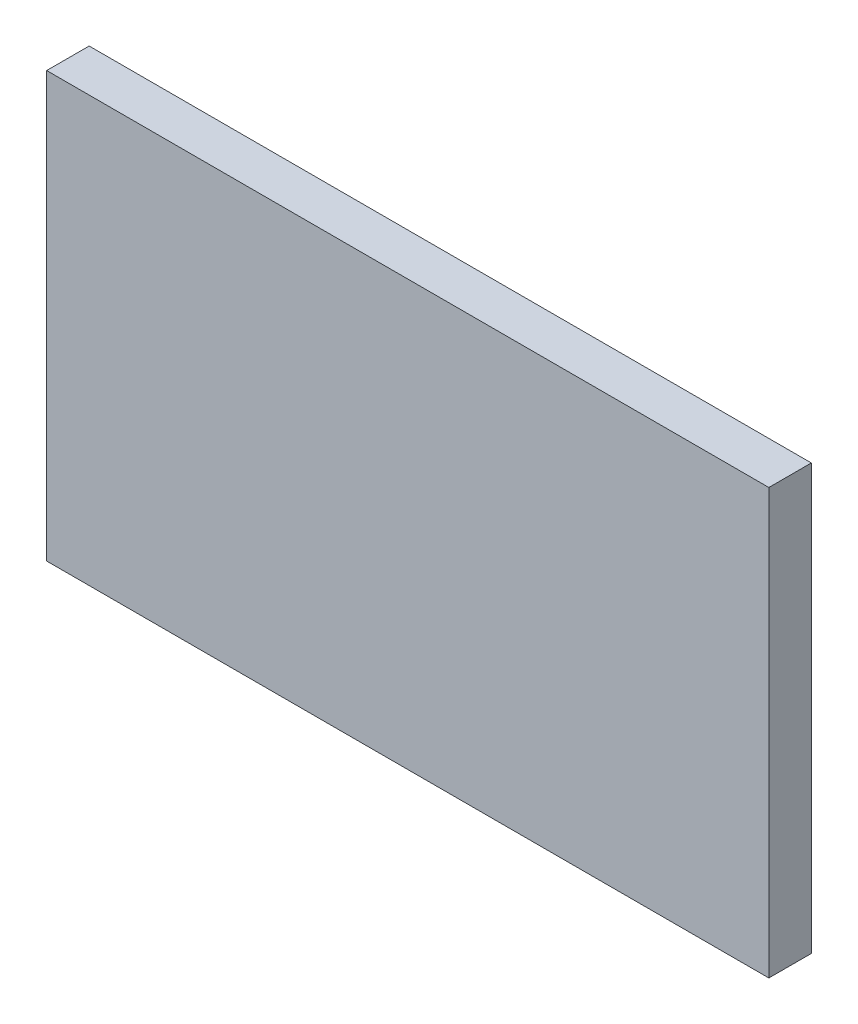
ISO-10303-21;
HEADER;
FILE_DESCRIPTION(('STEP AP214'),'2;1');
FILE_NAME('part.step','',(''),(''),'','','');
FILE_SCHEMA(('AUTOMOTIVE_DESIGN { 1 0 10303 214 1 1 1 1 }'));
ENDSEC;
DATA;
#1=APPLICATION_CONTEXT('core data for automotive mechanical design processes');
#2=APPLICATION_PROTOCOL_DEFINITION('international standard','automotive_design',2000,#1);
#3=PRODUCT_CONTEXT('',#1,'mechanical');
#4=PRODUCT('Part','Part','',(#3));
#5=PRODUCT_RELATED_PRODUCT_CATEGORY('part','',(#4));
#6=PRODUCT_DEFINITION_FORMATION('','',#4);
#7=PRODUCT_DEFINITION_CONTEXT('part definition',#1,'design');
#8=PRODUCT_DEFINITION('design','',#6,#7);
#9=PRODUCT_DEFINITION_SHAPE('','',#8);
#10=(LENGTH_UNIT() NAMED_UNIT(*) SI_UNIT(.MILLI.,.METRE.));
#11=(NAMED_UNIT(*) PLANE_ANGLE_UNIT() SI_UNIT($,.RADIAN.));
#12=(NAMED_UNIT(*) SI_UNIT($,.STERADIAN.) SOLID_ANGLE_UNIT());
#13=UNCERTAINTY_MEASURE_WITH_UNIT(LENGTH_MEASURE(1.E-05),#10,'distance_accuracy_value','');
#14=(GEOMETRIC_REPRESENTATION_CONTEXT(3) GLOBAL_UNCERTAINTY_ASSIGNED_CONTEXT((#13)) GLOBAL_UNIT_ASSIGNED_CONTEXT((#10,
#11,#12)) REPRESENTATION_CONTEXT('',''));
#15=CARTESIAN_POINT('',(0.,0.,0.));
#16=DIRECTION('',(0.,0.,1.));
#17=DIRECTION('',(1.,0.,0.));
#18=AXIS2_PLACEMENT_3D('',#15,#16,#17);
#19=CARTESIAN_POINT('',(53.975,31.75,6.35));
#20=DIRECTION('',(-1.,0.,0.));
#21=DIRECTION('',(0.,-1.,0.));
#22=AXIS2_PLACEMENT_3D('',#19,#20,#21);
#23=PLANE('',#22);
#24=DIRECTION('',(0.,1.,0.));
#25=VECTOR('',#24,1.);
#26=CARTESIAN_POINT('',(53.975,31.75,0.));
#27=LINE('',#26,#25);
#28=CARTESIAN_POINT('',(53.975,-31.75,0.));
#29=VERTEX_POINT('',#28);
#30=CARTESIAN_POINT('',(53.975,31.75,0.));
#31=VERTEX_POINT('',#30);
#32=EDGE_CURVE('E96',#29,#31,#27,.T.);
#33=ORIENTED_EDGE('',*,*,#32,.T.);
#34=DIRECTION('',(0.,0.,-1.));
#35=VECTOR('',#34,1.);
#36=CARTESIAN_POINT('',(53.975,31.75,6.35));
#37=LINE('',#36,#35);
#38=CARTESIAN_POINT('',(53.975,31.75,6.35));
#39=VERTEX_POINT('',#38);
#40=EDGE_CURVE('E11',#39,#31,#37,.T.);
#41=ORIENTED_EDGE('',*,*,#40,.F.);
#42=DIRECTION('',(0.,1.,0.));
#43=VECTOR('',#42,1.);
#44=CARTESIAN_POINT('',(53.975,31.75,6.35));
#45=LINE('',#44,#43);
#46=CARTESIAN_POINT('',(53.975,-31.75,6.35));
#47=VERTEX_POINT('',#46);
#48=EDGE_CURVE('E84',#47,#39,#45,.T.);
#49=ORIENTED_EDGE('',*,*,#48,.F.);
#50=DIRECTION('',(0.,0.,-1.));
#51=VECTOR('',#50,1.);
#52=CARTESIAN_POINT('',(53.975,-31.75,6.35));
#53=LINE('',#52,#51);
#54=EDGE_CURVE('E92',#47,#29,#53,.T.);
#55=ORIENTED_EDGE('',*,*,#54,.T.);
#56=EDGE_LOOP('',(#33,#41,#49,#55));
#57=FACE_BOUND('',#56,.T.);
#58=ADVANCED_FACE('F33',(#57),#23,.F.);
#59=CARTESIAN_POINT('',(-53.975,31.75,6.35));
#60=DIRECTION('',(0.,-1.,0.));
#61=DIRECTION('',(0.,0.,-1.));
#62=AXIS2_PLACEMENT_3D('',#59,#60,#61);
#63=PLANE('',#62);
#64=DIRECTION('',(-1.,0.,0.));
#65=VECTOR('',#64,1.);
#66=CARTESIAN_POINT('',(-53.975,31.75,0.));
#67=LINE('',#66,#65);
#68=CARTESIAN_POINT('',(-53.975,31.75,0.));
#69=VERTEX_POINT('',#68);
#70=EDGE_CURVE('E88',#31,#69,#67,.T.);
#71=ORIENTED_EDGE('',*,*,#70,.T.);
#72=DIRECTION('',(0.,0.,-1.));
#73=VECTOR('',#72,1.);
#74=CARTESIAN_POINT('',(-53.975,31.75,6.35));
#75=LINE('',#74,#73);
#76=CARTESIAN_POINT('',(-53.975,31.75,6.35));
#77=VERTEX_POINT('',#76);
#78=EDGE_CURVE('E41',#77,#69,#75,.T.);
#79=ORIENTED_EDGE('',*,*,#78,.F.);
#80=DIRECTION('',(-1.,0.,0.));
#81=VECTOR('',#80,1.);
#82=CARTESIAN_POINT('',(-53.975,31.75,6.35));
#83=LINE('',#82,#81);
#84=EDGE_CURVE('E79',#39,#77,#83,.T.);
#85=ORIENTED_EDGE('',*,*,#84,.F.);
#86=ORIENTED_EDGE('',*,*,#40,.T.);
#87=EDGE_LOOP('',(#71,#79,#85,#86));
#88=FACE_BOUND('',#87,.T.);
#89=ADVANCED_FACE('F87',(#88),#63,.F.);
#90=CARTESIAN_POINT('',(-53.975,31.75,6.35));
#91=DIRECTION('',(1.,0.,0.));
#92=DIRECTION('',(0.,1.,0.));
#93=AXIS2_PLACEMENT_3D('',#90,#91,#92);
#94=PLANE('',#93);
#95=DIRECTION('',(0.,-1.,0.));
#96=VECTOR('',#95,1.);
#97=CARTESIAN_POINT('',(-53.975,31.75,0.));
#98=LINE('',#97,#96);
#99=CARTESIAN_POINT('',(-53.975,-31.75,0.));
#100=VERTEX_POINT('',#99);
#101=EDGE_CURVE('E66',#69,#100,#98,.T.);
#102=ORIENTED_EDGE('',*,*,#101,.T.);
#103=DIRECTION('',(0.,0.,-1.));
#104=VECTOR('',#103,1.);
#105=CARTESIAN_POINT('',(-53.975,-31.75,6.35));
#106=LINE('',#105,#104);
#107=CARTESIAN_POINT('',(-53.975,-31.75,6.35));
#108=VERTEX_POINT('',#107);
#109=EDGE_CURVE('E89',#108,#100,#106,.T.);
#110=ORIENTED_EDGE('',*,*,#109,.F.);
#111=DIRECTION('',(0.,-1.,0.));
#112=VECTOR('',#111,1.);
#113=CARTESIAN_POINT('',(-53.975,31.75,6.35));
#114=LINE('',#113,#112);
#115=EDGE_CURVE('E82',#77,#108,#114,.T.);
#116=ORIENTED_EDGE('',*,*,#115,.F.);
#117=ORIENTED_EDGE('',*,*,#78,.T.);
#118=EDGE_LOOP('',(#102,#110,#116,#117));
#119=FACE_BOUND('',#118,.T.);
#120=ADVANCED_FACE('F90',(#119),#94,.F.);
#121=CARTESIAN_POINT('',(-53.975,-31.75,6.35));
#122=DIRECTION('',(0.,1.,0.));
#123=DIRECTION('',(0.,0.,1.));
#124=AXIS2_PLACEMENT_3D('',#121,#122,#123);
#125=PLANE('',#124);
#126=DIRECTION('',(1.,0.,0.));
#127=VECTOR('',#126,1.);
#128=CARTESIAN_POINT('',(-53.975,-31.75,0.));
#129=LINE('',#128,#127);
#130=EDGE_CURVE('E72',#100,#29,#129,.T.);
#131=ORIENTED_EDGE('',*,*,#130,.T.);
#132=ORIENTED_EDGE('',*,*,#54,.F.);
#133=DIRECTION('',(1.,0.,0.));
#134=VECTOR('',#133,1.);
#135=CARTESIAN_POINT('',(-53.975,-31.75,6.35));
#136=LINE('',#135,#134);
#137=EDGE_CURVE('E49',#108,#47,#136,.T.);
#138=ORIENTED_EDGE('',*,*,#137,.F.);
#139=ORIENTED_EDGE('',*,*,#109,.T.);
#140=EDGE_LOOP('',(#131,#132,#138,#139));
#141=FACE_BOUND('',#140,.T.);
#142=ADVANCED_FACE('F103',(#141),#125,.F.);
#143=CARTESIAN_POINT('',(0.,0.,6.35));
#144=DIRECTION('',(0.,0.,1.));
#145=DIRECTION('',(1.,0.,0.));
#146=AXIS2_PLACEMENT_3D('',#143,#144,#145);
#147=PLANE('',#146);
#148=ORIENTED_EDGE('',*,*,#48,.T.);
#149=ORIENTED_EDGE('',*,*,#84,.T.);
#150=ORIENTED_EDGE('',*,*,#115,.T.);
#151=ORIENTED_EDGE('',*,*,#137,.T.);
#152=EDGE_LOOP('',(#148,#149,#150,#151));
#153=FACE_BOUND('',#152,.T.);
#154=ADVANCED_FACE('F80',(#153),#147,.T.);
#155=CARTESIAN_POINT('',(0.,0.,0.));
#156=DIRECTION('',(0.,0.,1.));
#157=DIRECTION('',(1.,0.,0.));
#158=AXIS2_PLACEMENT_3D('',#155,#156,#157);
#159=PLANE('',#158);
#160=ORIENTED_EDGE('',*,*,#32,.F.);
#161=ORIENTED_EDGE('',*,*,#130,.F.);
#162=ORIENTED_EDGE('',*,*,#101,.F.);
#163=ORIENTED_EDGE('',*,*,#70,.F.);
#164=EDGE_LOOP('',(#160,#161,#162,#163));
#165=FACE_BOUND('',#164,.T.);
#166=ADVANCED_FACE('F106',(#165),#159,.F.);
#167=CLOSED_SHELL('',(#58,#89,#120,#142,#154,#166));
#168=MANIFOLD_SOLID_BREP('B2',#167);
#169=ADVANCED_BREP_SHAPE_REPRESENTATION('',(#18,#168),#14);
#170=SHAPE_DEFINITION_REPRESENTATION(#9,#169);
ENDSEC;
END-ISO-10303-21;
